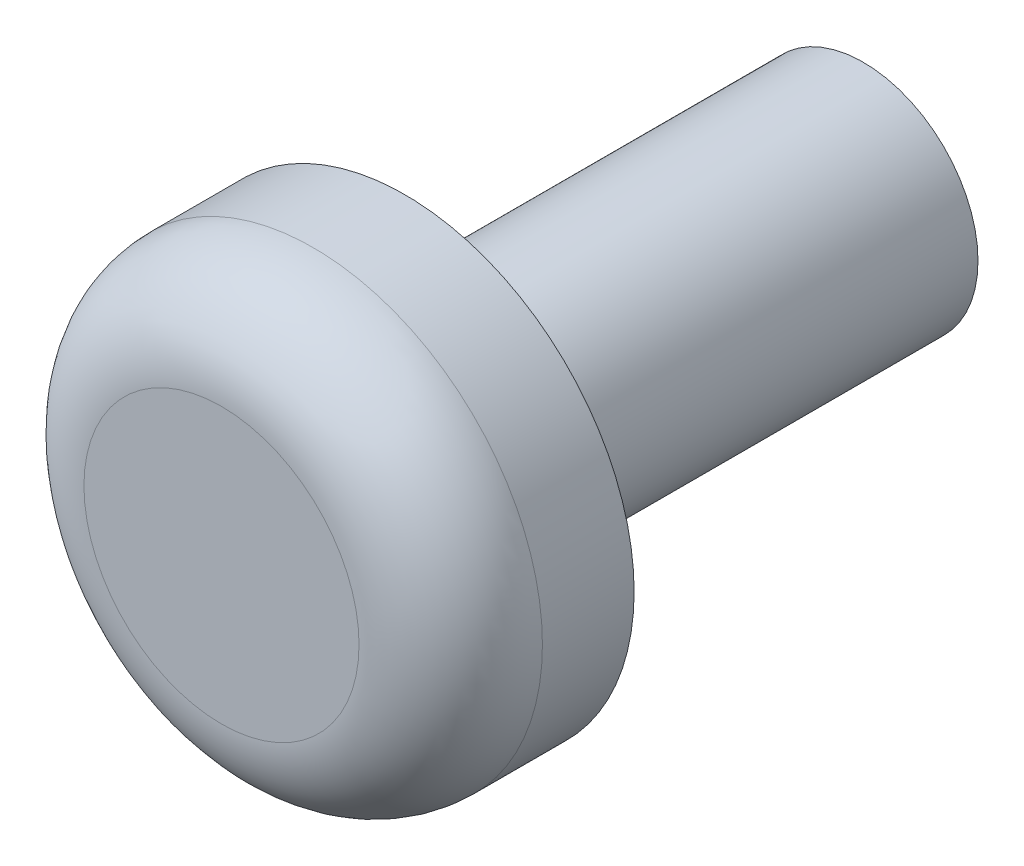
ISO-10303-21;
HEADER;
FILE_DESCRIPTION(('STEP AP214'),'2;1');
FILE_NAME('part.step','',(''),(''),'','','');
FILE_SCHEMA(('AUTOMOTIVE_DESIGN { 1 0 10303 214 1 1 1 1 }'));
ENDSEC;
DATA;
#1=APPLICATION_CONTEXT('core data for automotive mechanical design processes');
#2=APPLICATION_PROTOCOL_DEFINITION('international standard','automotive_design',2000,#1);
#3=PRODUCT_CONTEXT('',#1,'mechanical');
#4=PRODUCT('Part','Part','',(#3));
#5=PRODUCT_RELATED_PRODUCT_CATEGORY('part','',(#4));
#6=PRODUCT_DEFINITION_FORMATION('','',#4);
#7=PRODUCT_DEFINITION_CONTEXT('part definition',#1,'design');
#8=PRODUCT_DEFINITION('design','',#6,#7);
#9=PRODUCT_DEFINITION_SHAPE('','',#8);
#10=(LENGTH_UNIT() NAMED_UNIT(*) SI_UNIT(.MILLI.,.METRE.));
#11=(NAMED_UNIT(*) PLANE_ANGLE_UNIT() SI_UNIT($,.RADIAN.));
#12=(NAMED_UNIT(*) SI_UNIT($,.STERADIAN.) SOLID_ANGLE_UNIT());
#13=UNCERTAINTY_MEASURE_WITH_UNIT(LENGTH_MEASURE(1.E-05),#10,'distance_accuracy_value','');
#14=(GEOMETRIC_REPRESENTATION_CONTEXT(3) GLOBAL_UNCERTAINTY_ASSIGNED_CONTEXT((#13)) GLOBAL_UNIT_ASSIGNED_CONTEXT((#10,
#11,#12)) REPRESENTATION_CONTEXT('',''));
#15=CARTESIAN_POINT('',(0.,0.,0.));
#16=DIRECTION('',(0.,0.,1.));
#17=DIRECTION('',(1.,0.,0.));
#18=AXIS2_PLACEMENT_3D('',#15,#16,#17);
#19=CARTESIAN_POINT('',(0.,0.,5.));
#20=DIRECTION('',(0.,0.,-1.));
#21=DIRECTION('',(-1.,0.,0.));
#22=AXIS2_PLACEMENT_3D('',#19,#20,#21);
#23=CYLINDRICAL_SURFACE('',#22,1.25);
#24=CARTESIAN_POINT('',(0.,0.,5.));
#25=DIRECTION('',(0.,0.,1.));
#26=DIRECTION('',(1.,0.,0.));
#27=AXIS2_PLACEMENT_3D('',#24,#25,#26);
#28=CIRCLE('',#27,1.25);
#29=CARTESIAN_POINT('',(1.25,0.,5.));
#30=VERTEX_POINT('',#29);
#31=EDGE_CURVE('E42',#30,#30,#28,.T.);
#32=ORIENTED_EDGE('',*,*,#31,.F.);
#33=EDGE_LOOP('',(#32));
#34=FACE_BOUND('',#33,.T.);
#35=CARTESIAN_POINT('',(0.,0.,0.));
#36=DIRECTION('',(0.,0.,1.));
#37=DIRECTION('',(1.,0.,0.));
#38=AXIS2_PLACEMENT_3D('',#35,#36,#37);
#39=CIRCLE('',#38,1.25);
#40=CARTESIAN_POINT('',(1.25,0.,0.));
#41=VERTEX_POINT('',#40);
#42=EDGE_CURVE('E46',#41,#41,#39,.T.);
#43=ORIENTED_EDGE('',*,*,#42,.T.);
#44=EDGE_LOOP('',(#43));
#45=FACE_BOUND('',#44,.T.);
#46=ADVANCED_FACE('F31',(#34,#45),#23,.T.);
#47=CARTESIAN_POINT('',(0.,0.,0.));
#48=DIRECTION('',(0.,0.,1.));
#49=DIRECTION('',(1.,0.,0.));
#50=AXIS2_PLACEMENT_3D('',#47,#48,#49);
#51=PLANE('',#50);
#52=ORIENTED_EDGE('',*,*,#42,.F.);
#53=EDGE_LOOP('',(#52));
#54=FACE_BOUND('',#53,.T.);
#55=ADVANCED_FACE('F70',(#54),#51,.F.);
#56=CARTESIAN_POINT('',(0.,0.,7.));
#57=DIRECTION('',(0.,0.,-1.));
#58=DIRECTION('',(-1.,0.,0.));
#59=AXIS2_PLACEMENT_3D('',#56,#57,#58);
#60=CYLINDRICAL_SURFACE('',#59,2.5);
#61=CARTESIAN_POINT('',(0.,0.,6.));
#62=DIRECTION('',(0.,0.,1.));
#63=DIRECTION('',(1.,0.,0.));
#64=AXIS2_PLACEMENT_3D('',#61,#62,#63);
#65=CIRCLE('',#64,2.5);
#66=CARTESIAN_POINT('',(2.5,0.,6.));
#67=VERTEX_POINT('',#66);
#68=EDGE_CURVE('E10',#67,#67,#65,.F.);
#69=ORIENTED_EDGE('',*,*,#68,.T.);
#70=EDGE_LOOP('',(#69));
#71=FACE_BOUND('',#70,.T.);
#72=CARTESIAN_POINT('',(0.,0.,5.));
#73=DIRECTION('',(0.,0.,1.));
#74=DIRECTION('',(1.,0.,0.));
#75=AXIS2_PLACEMENT_3D('',#72,#73,#74);
#76=CIRCLE('',#75,2.5);
#77=CARTESIAN_POINT('',(2.5,0.,5.));
#78=VERTEX_POINT('',#77);
#79=EDGE_CURVE('E50',#78,#78,#76,.T.);
#80=ORIENTED_EDGE('',*,*,#79,.T.);
#81=EDGE_LOOP('',(#80));
#82=FACE_BOUND('',#81,.T.);
#83=ADVANCED_FACE('F55',(#71,#82),#60,.T.);
#84=CARTESIAN_POINT('',(0.,0.,7.));
#85=DIRECTION('',(0.,0.,1.));
#86=DIRECTION('',(1.,0.,0.));
#87=AXIS2_PLACEMENT_3D('',#84,#85,#86);
#88=PLANE('',#87);
#89=CARTESIAN_POINT('',(0.,0.,7.));
#90=DIRECTION('',(0.,0.,1.));
#91=DIRECTION('',(1.,0.,0.));
#92=AXIS2_PLACEMENT_3D('',#89,#90,#91);
#93=CIRCLE('',#92,1.5);
#94=CARTESIAN_POINT('',(1.5,0.,7.));
#95=VERTEX_POINT('',#94);
#96=EDGE_CURVE('E38',#95,#95,#93,.T.);
#97=ORIENTED_EDGE('',*,*,#96,.T.);
#98=EDGE_LOOP('',(#97));
#99=FACE_BOUND('',#98,.T.);
#100=ADVANCED_FACE('F59',(#99),#88,.T.);
#101=CARTESIAN_POINT('',(0.,0.,5.));
#102=DIRECTION('',(0.,0.,1.));
#103=DIRECTION('',(1.,0.,0.));
#104=AXIS2_PLACEMENT_3D('',#101,#102,#103);
#105=PLANE('',#104);
#106=ORIENTED_EDGE('',*,*,#31,.T.);
#107=EDGE_LOOP('',(#106));
#108=FACE_BOUND('',#107,.T.);
#109=ORIENTED_EDGE('',*,*,#79,.F.);
#110=EDGE_LOOP('',(#109));
#111=FACE_BOUND('',#110,.T.);
#112=ADVANCED_FACE('F57',(#108,#111),#105,.F.);
#113=CARTESIAN_POINT('',(0.,0.,6.));
#114=DIRECTION('',(0.,0.,1.));
#115=DIRECTION('',(1.,0.,0.));
#116=AXIS2_PLACEMENT_3D('',#113,#114,#115);
#117=TOROIDAL_SURFACE('',#116,1.5,1.);
#118=ORIENTED_EDGE('',*,*,#68,.F.);
#119=EDGE_LOOP('',(#118));
#120=FACE_BOUND('',#119,.T.);
#121=ORIENTED_EDGE('',*,*,#96,.F.);
#122=EDGE_LOOP('',(#121));
#123=FACE_BOUND('',#122,.T.);
#124=ADVANCED_FACE('F33',(#120,#123),#117,.T.);
#125=CLOSED_SHELL('',(#46,#55,#83,#100,#112,#124));
#126=MANIFOLD_SOLID_BREP('B2',#125);
#127=ADVANCED_BREP_SHAPE_REPRESENTATION('',(#18,#126),#14);
#128=SHAPE_DEFINITION_REPRESENTATION(#9,#127);
ENDSEC;
END-ISO-10303-21;
